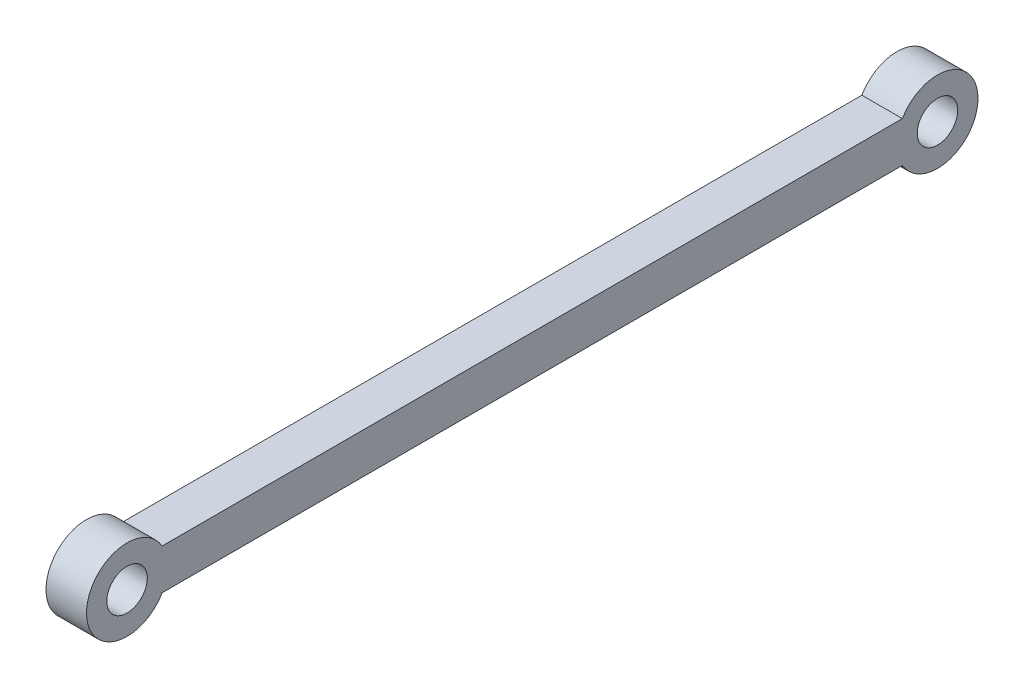
ISO-10303-21;
HEADER;
FILE_DESCRIPTION(('STEP AP214'),'2;1');
FILE_NAME('part.step','',(''),(''),'','','');
FILE_SCHEMA(('AUTOMOTIVE_DESIGN { 1 0 10303 214 1 1 1 1 }'));
ENDSEC;
DATA;
#1=APPLICATION_CONTEXT('core data for automotive mechanical design processes');
#2=APPLICATION_PROTOCOL_DEFINITION('international standard','automotive_design',2000,#1);
#3=PRODUCT_CONTEXT('',#1,'mechanical');
#4=PRODUCT('Part','Part','',(#3));
#5=PRODUCT_RELATED_PRODUCT_CATEGORY('part','',(#4));
#6=PRODUCT_DEFINITION_FORMATION('','',#4);
#7=PRODUCT_DEFINITION_CONTEXT('part definition',#1,'design');
#8=PRODUCT_DEFINITION('design','',#6,#7);
#9=PRODUCT_DEFINITION_SHAPE('','',#8);
#10=(LENGTH_UNIT() NAMED_UNIT(*) SI_UNIT(.MILLI.,.METRE.));
#11=(NAMED_UNIT(*) PLANE_ANGLE_UNIT() SI_UNIT($,.RADIAN.));
#12=(NAMED_UNIT(*) SI_UNIT($,.STERADIAN.) SOLID_ANGLE_UNIT());
#13=UNCERTAINTY_MEASURE_WITH_UNIT(LENGTH_MEASURE(1.E-05),#10,'distance_accuracy_value','');
#14=(GEOMETRIC_REPRESENTATION_CONTEXT(3) GLOBAL_UNCERTAINTY_ASSIGNED_CONTEXT((#13)) GLOBAL_UNIT_ASSIGNED_CONTEXT((#10,
#11,#12)) REPRESENTATION_CONTEXT('',''));
#15=CARTESIAN_POINT('',(0.,0.,0.));
#16=DIRECTION('',(0.,0.,1.));
#17=DIRECTION('',(1.,0.,0.));
#18=AXIS2_PLACEMENT_3D('',#15,#16,#17);
#19=CARTESIAN_POINT('',(2.5,0.,25.));
#20=DIRECTION('',(1.,0.,0.));
#21=DIRECTION('',(0.,0.,-1.));
#22=AXIS2_PLACEMENT_3D('',#19,#20,#21);
#23=PLANE('',#22);
#24=CARTESIAN_POINT('',(2.5,0.,25.));
#25=DIRECTION('',(1.,0.,0.));
#26=DIRECTION('',(0.,0.,-1.));
#27=AXIS2_PLACEMENT_3D('',#24,#25,#26);
#28=CIRCLE('',#27,1.25);
#29=CARTESIAN_POINT('',(2.5,0.,23.75));
#30=VERTEX_POINT('',#29);
#31=EDGE_CURVE('E104',#30,#30,#28,.T.);
#32=ORIENTED_EDGE('',*,*,#31,.F.);
#33=EDGE_LOOP('',(#32));
#34=FACE_BOUND('',#33,.T.);
#35=CARTESIAN_POINT('',(2.5,0.,25.));
#36=DIRECTION('',(1.,0.,0.));
#37=DIRECTION('',(0.,0.,-1.));
#38=AXIS2_PLACEMENT_3D('',#35,#36,#37);
#39=CIRCLE('',#38,2.5);
#40=CARTESIAN_POINT('',(2.5,1.25,22.8349364905389));
#41=VERTEX_POINT('',#40);
#42=CARTESIAN_POINT('',(2.5,-1.25,22.8349364905389));
#43=VERTEX_POINT('',#42);
#44=EDGE_CURVE('E89',#41,#43,#39,.T.);
#45=ORIENTED_EDGE('',*,*,#44,.T.);
#46=DIRECTION('',(0.,0.,-1.));
#47=VECTOR('',#46,1.);
#48=CARTESIAN_POINT('',(2.5,-1.25,22.8349364905389));
#49=LINE('',#48,#47);
#50=CARTESIAN_POINT('',(2.5,-1.25,-22.8349364905389));
#51=VERTEX_POINT('',#50);
#52=EDGE_CURVE('E84',#43,#51,#49,.T.);
#53=ORIENTED_EDGE('',*,*,#52,.T.);
#54=CARTESIAN_POINT('',(2.5,0.,-25.));
#55=DIRECTION('',(1.,0.,0.));
#56=DIRECTION('',(0.,0.,-1.));
#57=AXIS2_PLACEMENT_3D('',#54,#55,#56);
#58=CIRCLE('',#57,2.5);
#59=CARTESIAN_POINT('',(2.5,1.25,-22.8349364905389));
#60=VERTEX_POINT('',#59);
#61=EDGE_CURVE('E87',#51,#60,#58,.T.);
#62=ORIENTED_EDGE('',*,*,#61,.T.);
#63=DIRECTION('',(0.,0.,1.));
#64=VECTOR('',#63,1.);
#65=CARTESIAN_POINT('',(2.5,1.25,22.8349364905389));
#66=LINE('',#65,#64);
#67=EDGE_CURVE('E54',#60,#41,#66,.T.);
#68=ORIENTED_EDGE('',*,*,#67,.T.);
#69=EDGE_LOOP('',(#45,#53,#62,#68));
#70=FACE_BOUND('',#69,.T.);
#71=CARTESIAN_POINT('',(2.5,0.,-25.));
#72=DIRECTION('',(1.,0.,0.));
#73=DIRECTION('',(0.,0.,-1.));
#74=AXIS2_PLACEMENT_3D('',#71,#72,#73);
#75=CIRCLE('',#74,1.25);
#76=CARTESIAN_POINT('',(2.5,0.,-26.25));
#77=VERTEX_POINT('',#76);
#78=EDGE_CURVE('E119',#77,#77,#75,.T.);
#79=ORIENTED_EDGE('',*,*,#78,.F.);
#80=EDGE_LOOP('',(#79));
#81=FACE_BOUND('',#80,.T.);
#82=ADVANCED_FACE('F37',(#34,#70,#81),#23,.T.);
#83=CARTESIAN_POINT('',(0.,0.,25.));
#84=DIRECTION('',(1.,0.,0.));
#85=DIRECTION('',(0.,0.,-1.));
#86=AXIS2_PLACEMENT_3D('',#83,#84,#85);
#87=PLANE('',#86);
#88=CARTESIAN_POINT('',(0.,0.,25.));
#89=DIRECTION('',(1.,0.,0.));
#90=DIRECTION('',(0.,0.,-1.));
#91=AXIS2_PLACEMENT_3D('',#88,#89,#90);
#92=CIRCLE('',#91,2.5);
#93=CARTESIAN_POINT('',(0.,1.25,22.8349364905389));
#94=VERTEX_POINT('',#93);
#95=CARTESIAN_POINT('',(0.,-1.25,22.8349364905389));
#96=VERTEX_POINT('',#95);
#97=EDGE_CURVE('E101',#94,#96,#92,.T.);
#98=ORIENTED_EDGE('',*,*,#97,.F.);
#99=DIRECTION('',(0.,0.,1.));
#100=VECTOR('',#99,1.);
#101=CARTESIAN_POINT('',(0.,1.25,22.8349364905389));
#102=LINE('',#101,#100);
#103=CARTESIAN_POINT('',(0.,1.25,-22.8349364905389));
#104=VERTEX_POINT('',#103);
#105=EDGE_CURVE('E77',#104,#94,#102,.T.);
#106=ORIENTED_EDGE('',*,*,#105,.F.);
#107=CARTESIAN_POINT('',(0.,0.,-25.));
#108=DIRECTION('',(1.,0.,0.));
#109=DIRECTION('',(0.,0.,-1.));
#110=AXIS2_PLACEMENT_3D('',#107,#108,#109);
#111=CIRCLE('',#110,2.5);
#112=CARTESIAN_POINT('',(0.,-1.25,-22.8349364905389));
#113=VERTEX_POINT('',#112);
#114=EDGE_CURVE('E71',#113,#104,#111,.T.);
#115=ORIENTED_EDGE('',*,*,#114,.F.);
#116=DIRECTION('',(0.,0.,-1.));
#117=VECTOR('',#116,1.);
#118=CARTESIAN_POINT('',(0.,-1.25,22.8349364905389));
#119=LINE('',#118,#117);
#120=EDGE_CURVE('E93',#96,#113,#119,.T.);
#121=ORIENTED_EDGE('',*,*,#120,.F.);
#122=EDGE_LOOP('',(#98,#106,#115,#121));
#123=FACE_BOUND('',#122,.T.);
#124=CARTESIAN_POINT('',(0.,0.,25.));
#125=DIRECTION('',(1.,0.,0.));
#126=DIRECTION('',(0.,0.,-1.));
#127=AXIS2_PLACEMENT_3D('',#124,#125,#126);
#128=CIRCLE('',#127,1.25);
#129=CARTESIAN_POINT('',(0.,0.,23.75));
#130=VERTEX_POINT('',#129);
#131=EDGE_CURVE('E116',#130,#130,#128,.T.);
#132=ORIENTED_EDGE('',*,*,#131,.T.);
#133=EDGE_LOOP('',(#132));
#134=FACE_BOUND('',#133,.T.);
#135=CARTESIAN_POINT('',(0.,0.,-25.));
#136=DIRECTION('',(1.,0.,0.));
#137=DIRECTION('',(0.,0.,-1.));
#138=AXIS2_PLACEMENT_3D('',#135,#136,#137);
#139=CIRCLE('',#138,1.25);
#140=CARTESIAN_POINT('',(0.,0.,-26.25));
#141=VERTEX_POINT('',#140);
#142=EDGE_CURVE('E122',#141,#141,#139,.T.);
#143=ORIENTED_EDGE('',*,*,#142,.T.);
#144=EDGE_LOOP('',(#143));
#145=FACE_BOUND('',#144,.T.);
#146=ADVANCED_FACE('F112',(#123,#134,#145),#87,.F.);
#147=CARTESIAN_POINT('',(2.5,0.,25.));
#148=DIRECTION('',(-1.,0.,0.));
#149=DIRECTION('',(0.,0.,1.));
#150=AXIS2_PLACEMENT_3D('',#147,#148,#149);
#151=CYLINDRICAL_SURFACE('',#150,2.5);
#152=ORIENTED_EDGE('',*,*,#97,.T.);
#153=DIRECTION('',(-1.,0.,0.));
#154=VECTOR('',#153,1.);
#155=CARTESIAN_POINT('',(2.5,-1.25,22.8349364905389));
#156=LINE('',#155,#154);
#157=EDGE_CURVE('E11',#43,#96,#156,.T.);
#158=ORIENTED_EDGE('',*,*,#157,.F.);
#159=ORIENTED_EDGE('',*,*,#44,.F.);
#160=DIRECTION('',(-1.,0.,0.));
#161=VECTOR('',#160,1.);
#162=CARTESIAN_POINT('',(2.5,1.25,22.8349364905389));
#163=LINE('',#162,#161);
#164=EDGE_CURVE('E97',#41,#94,#163,.T.);
#165=ORIENTED_EDGE('',*,*,#164,.T.);
#166=EDGE_LOOP('',(#152,#158,#159,#165));
#167=FACE_BOUND('',#166,.T.);
#168=ADVANCED_FACE('F39',(#167),#151,.T.);
#169=CARTESIAN_POINT('',(2.5,-1.25,22.8349364905389));
#170=DIRECTION('',(0.,1.,0.));
#171=DIRECTION('',(0.,0.,1.));
#172=AXIS2_PLACEMENT_3D('',#169,#170,#171);
#173=PLANE('',#172);
#174=ORIENTED_EDGE('',*,*,#120,.T.);
#175=DIRECTION('',(-1.,0.,0.));
#176=VECTOR('',#175,1.);
#177=CARTESIAN_POINT('',(2.5,-1.25,-22.8349364905389));
#178=LINE('',#177,#176);
#179=EDGE_CURVE('E46',#51,#113,#178,.T.);
#180=ORIENTED_EDGE('',*,*,#179,.F.);
#181=ORIENTED_EDGE('',*,*,#52,.F.);
#182=ORIENTED_EDGE('',*,*,#157,.T.);
#183=EDGE_LOOP('',(#174,#180,#181,#182));
#184=FACE_BOUND('',#183,.T.);
#185=ADVANCED_FACE('F92',(#184),#173,.F.);
#186=CARTESIAN_POINT('',(2.5,0.,-25.));
#187=DIRECTION('',(-1.,0.,0.));
#188=DIRECTION('',(0.,0.,1.));
#189=AXIS2_PLACEMENT_3D('',#186,#187,#188);
#190=CYLINDRICAL_SURFACE('',#189,2.5);
#191=ORIENTED_EDGE('',*,*,#114,.T.);
#192=DIRECTION('',(-1.,0.,0.));
#193=VECTOR('',#192,1.);
#194=CARTESIAN_POINT('',(2.5,1.25,-22.8349364905389));
#195=LINE('',#194,#193);
#196=EDGE_CURVE('E94',#60,#104,#195,.T.);
#197=ORIENTED_EDGE('',*,*,#196,.F.);
#198=ORIENTED_EDGE('',*,*,#61,.F.);
#199=ORIENTED_EDGE('',*,*,#179,.T.);
#200=EDGE_LOOP('',(#191,#197,#198,#199));
#201=FACE_BOUND('',#200,.T.);
#202=ADVANCED_FACE('F95',(#201),#190,.T.);
#203=CARTESIAN_POINT('',(2.5,1.25,22.8349364905389));
#204=DIRECTION('',(0.,-1.,0.));
#205=DIRECTION('',(0.,0.,-1.));
#206=AXIS2_PLACEMENT_3D('',#203,#204,#205);
#207=PLANE('',#206);
#208=ORIENTED_EDGE('',*,*,#105,.T.);
#209=ORIENTED_EDGE('',*,*,#164,.F.);
#210=ORIENTED_EDGE('',*,*,#67,.F.);
#211=ORIENTED_EDGE('',*,*,#196,.T.);
#212=EDGE_LOOP('',(#208,#209,#210,#211));
#213=FACE_BOUND('',#212,.T.);
#214=ADVANCED_FACE('F109',(#213),#207,.F.);
#215=CARTESIAN_POINT('',(2.5,0.,25.));
#216=DIRECTION('',(-1.,0.,0.));
#217=DIRECTION('',(0.,0.,1.));
#218=AXIS2_PLACEMENT_3D('',#215,#216,#217);
#219=CYLINDRICAL_SURFACE('',#218,1.25);
#220=ORIENTED_EDGE('',*,*,#31,.T.);
#221=EDGE_LOOP('',(#220));
#222=FACE_BOUND('',#221,.T.);
#223=ORIENTED_EDGE('',*,*,#131,.F.);
#224=EDGE_LOOP('',(#223));
#225=FACE_BOUND('',#224,.T.);
#226=ADVANCED_FACE('F139',(#222,#225),#219,.F.);
#227=CARTESIAN_POINT('',(2.5,0.,-25.));
#228=DIRECTION('',(-1.,0.,0.));
#229=DIRECTION('',(0.,0.,1.));
#230=AXIS2_PLACEMENT_3D('',#227,#228,#229);
#231=CYLINDRICAL_SURFACE('',#230,1.25);
#232=ORIENTED_EDGE('',*,*,#78,.T.);
#233=EDGE_LOOP('',(#232));
#234=FACE_BOUND('',#233,.T.);
#235=ORIENTED_EDGE('',*,*,#142,.F.);
#236=EDGE_LOOP('',(#235));
#237=FACE_BOUND('',#236,.T.);
#238=ADVANCED_FACE('F128',(#234,#237),#231,.F.);
#239=CLOSED_SHELL('',(#82,#146,#168,#185,#202,#214,#226,#238));
#240=MANIFOLD_SOLID_BREP('B2',#239);
#241=ADVANCED_BREP_SHAPE_REPRESENTATION('',(#18,#240),#14);
#242=SHAPE_DEFINITION_REPRESENTATION(#9,#241);
ENDSEC;
END-ISO-10303-21;
